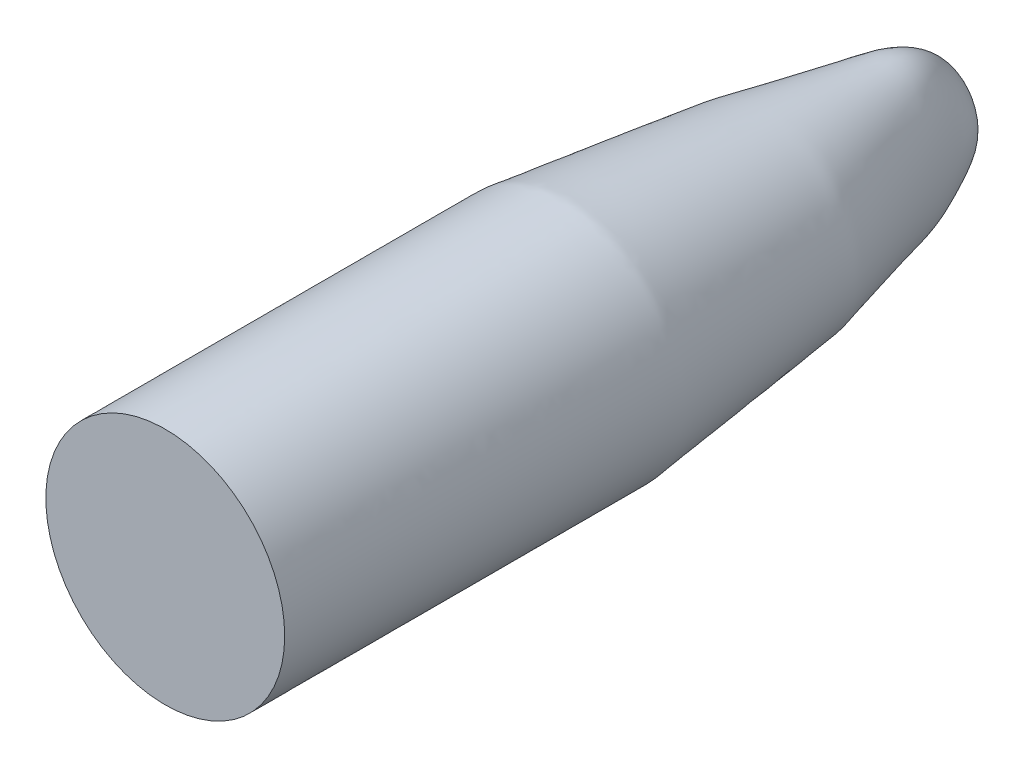
ISO-10303-21;
HEADER;
FILE_DESCRIPTION(('STEP AP214'),'2;1');
FILE_NAME('part.step','',(''),(''),'','','');
FILE_SCHEMA(('AUTOMOTIVE_DESIGN { 1 0 10303 214 1 1 1 1 }'));
ENDSEC;
DATA;
#1=APPLICATION_CONTEXT('core data for automotive mechanical design processes');
#2=APPLICATION_PROTOCOL_DEFINITION('international standard','automotive_design',2000,#1);
#3=PRODUCT_CONTEXT('',#1,'mechanical');
#4=PRODUCT('Part','Part','',(#3));
#5=PRODUCT_RELATED_PRODUCT_CATEGORY('part','',(#4));
#6=PRODUCT_DEFINITION_FORMATION('','',#4);
#7=PRODUCT_DEFINITION_CONTEXT('part definition',#1,'design');
#8=PRODUCT_DEFINITION('design','',#6,#7);
#9=PRODUCT_DEFINITION_SHAPE('','',#8);
#10=(LENGTH_UNIT() NAMED_UNIT(*) SI_UNIT(.MILLI.,.METRE.));
#11=(NAMED_UNIT(*) PLANE_ANGLE_UNIT() SI_UNIT($,.RADIAN.));
#12=(NAMED_UNIT(*) SI_UNIT($,.STERADIAN.) SOLID_ANGLE_UNIT());
#13=UNCERTAINTY_MEASURE_WITH_UNIT(LENGTH_MEASURE(1.E-05),#10,'distance_accuracy_value','');
#14=(GEOMETRIC_REPRESENTATION_CONTEXT(3) GLOBAL_UNCERTAINTY_ASSIGNED_CONTEXT((#13)) GLOBAL_UNIT_ASSIGNED_CONTEXT((#10,
#11,#12)) REPRESENTATION_CONTEXT('',''));
#15=CARTESIAN_POINT('',(0.,0.,0.));
#16=DIRECTION('',(0.,0.,1.));
#17=DIRECTION('',(1.,0.,0.));
#18=AXIS2_PLACEMENT_3D('',#15,#16,#17);
#19=CARTESIAN_POINT('',(0.,0.,0.));
#20=DIRECTION('',(0.,0.,1.));
#21=DIRECTION('',(1.,0.,0.));
#22=AXIS2_PLACEMENT_3D('',#19,#20,#21);
#23=PLANE('',#22);
#24=CARTESIAN_POINT('',(0.,0.,0.));
#25=DIRECTION('',(0.,0.,1.));
#26=DIRECTION('',(1.,0.,0.));
#27=AXIS2_PLACEMENT_3D('',#24,#25,#26);
#28=CIRCLE('',#27,6.);
#29=CARTESIAN_POINT('',(6.,0.,0.));
#30=VERTEX_POINT('',#29);
#31=EDGE_CURVE('E13',#30,#30,#28,.T.);
#32=ORIENTED_EDGE('',*,*,#31,.T.);
#33=EDGE_LOOP('',(#32));
#34=FACE_BOUND('',#33,.T.);
#35=ADVANCED_FACE('F114',(#34),#23,.T.);
#36=CARTESIAN_POINT('',(6.,0.,0.));
#37=CARTESIAN_POINT('',(6.,0.,-0.414814814814815));
#38=CARTESIAN_POINT('',(6.00001420185176,0.,-1.2444111321226));
#39=CARTESIAN_POINT('',(6.00006640985377,0.,-2.48872839842398));
#40=CARTESIAN_POINT('',(6.00014207351683,0.,-3.80705444331949));
#41=CARTESIAN_POINT('',(6.00023113572833,0.,-5.19940503915875));
#42=CARTESIAN_POINT('',(6.00032393865417,0.,-6.7991194723834));
#43=CARTESIAN_POINT('',(6.00038702697007,0.,-8.53218413886045));
#44=CARTESIAN_POINT('',(6.00037150531481,0.,-10.2653656136855));
#45=CARTESIAN_POINT('',(6.00026216831516,0.,-11.8653804066354));
#46=CARTESIAN_POINT('',(6.00004832753572,0.,-13.465572163283));
#47=CARTESIAN_POINT('',(5.9997591793125,0.,-14.7642307998094));
#48=CARTESIAN_POINT('',(5.9993841645168,0.,-16.0091900010634));
#49=CARTESIAN_POINT('',(5.99897862525038,0.,-17.1208865536565));
#50=CARTESIAN_POINT('',(5.99893365039298,0.,-18.2163341221828));
#51=CARTESIAN_POINT('',(5.99939548447932,0.,-19.0957523697179));
#52=CARTESIAN_POINT('',(5.99984997916987,0.,-19.5852399626314));
#53=CARTESIAN_POINT('',(6.00150472005289,0.,-19.9017644598478));
#54=CARTESIAN_POINT('',(5.996129891164,0.,-19.9998195550295));
#55=CARTESIAN_POINT('',(5.99558002790296,0.,-20.0098473567209));
#56=CARTESIAN_POINT('',(5.98837930322439,0.,-20.1278339676391));
#57=CARTESIAN_POINT('',(5.88039514830993,0.,-20.8860189548205));
#58=CARTESIAN_POINT('',(5.52781604612227,0.,-23.7834336674152));
#59=CARTESIAN_POINT('',(5.18454630374735,0.,-26.7923540244967));
#60=CARTESIAN_POINT('',(4.84472626496984,0.,-29.3603382285488));
#61=CARTESIAN_POINT('',(4.78835475473473,0.,-30.0087891881812));
#62=CARTESIAN_POINT('',(4.55861332183848,0.,-30.6179496993016));
#63=CARTESIAN_POINT('',(4.02767985190393,0.,-32.2609183020531));
#64=CARTESIAN_POINT('',(3.39584537371439,0.,-34.1005896008366));
#65=CARTESIAN_POINT('',(2.71494094961282,0.,-36.1506584456956));
#66=CARTESIAN_POINT('',(2.37587641694779,0.,-37.1767522556246));
#67=CARTESIAN_POINT('',(2.02074718443247,0.,-38.1942956962808));
#68=CARTESIAN_POINT('',(1.66976123000768,0.,-39.4784536691222));
#69=CARTESIAN_POINT('',(0.64788689143517,0.,-39.9952551232074));
#70=CARTESIAN_POINT('',(0.,0.,-40.));
#71=CARTESIAN_POINT('',(6.,-3.3114900595386,0.));
#72=CARTESIAN_POINT('',(6.,-3.31149005955954,-0.414814814814815));
#73=CARTESIAN_POINT('',(6.00001420185176,-3.31148939035369,-1.2444111321226));
#74=CARTESIAN_POINT('',(6.00006640985377,-3.31148814403347,-2.48872839842398));
#75=CARTESIAN_POINT('',(6.00014207351683,-3.31148843928255,-3.8070544433195));
#76=CARTESIAN_POINT('',(6.00023113572832,-3.31149275349493,-5.19940503915876));
#77=CARTESIAN_POINT('',(6.00032393865417,-3.31150587715141,-6.79911947238342));
#78=CARTESIAN_POINT('',(6.00038702697006,-3.31153385766345,-8.53218413886047));
#79=CARTESIAN_POINT('',(6.00037150531481,-3.31158344984076,-10.2653656136855));
#80=CARTESIAN_POINT('',(6.00026216831516,-3.31164961761649,-11.8653804066354));
#81=CARTESIAN_POINT('',(6.00004832753572,-3.31174402474773,-13.465572163283));
#82=CARTESIAN_POINT('',(5.9997591793125,-3.31182424333871,-14.7642307998094));
#83=CARTESIAN_POINT('',(5.9993841645168,-3.31196720643618,-16.0091900010634));
#84=CARTESIAN_POINT('',(5.99897862525038,-3.31209510552606,-17.1208865536565));
#85=CARTESIAN_POINT('',(5.99893365039298,-3.31179784557454,-18.2163341221828));
#86=CARTESIAN_POINT('',(5.99939548447932,-3.31166448406237,-19.0957523697179));
#87=CARTESIAN_POINT('',(5.99984997916987,-3.31137531185018,-19.5852399626314));
#88=CARTESIAN_POINT('',(6.00150472005288,-3.31229252496899,-19.9017644599462));
#89=CARTESIAN_POINT('',(5.996129891164,-3.30945188410683,-19.9998195551281));
#90=CARTESIAN_POINT('',(5.99558002790296,-3.30916127729427,-20.0098473568195));
#91=CARTESIAN_POINT('',(5.98837930322439,-3.30535399892508,-20.1278339677377));
#92=CARTESIAN_POINT('',(5.88039514830993,-3.24812721550649,-20.8860189548205));
#93=CARTESIAN_POINT('',(5.52781604612227,-3.05634053766797,-23.7834336674152));
#94=CARTESIAN_POINT('',(5.18454630374735,-2.83496105781337,-26.7923540244967));
#95=CARTESIAN_POINT('',(4.84472626496984,-2.63304322749711,-29.3603382285488));
#96=CARTESIAN_POINT('',(4.78835475473473,-2.58210775340949,-30.0087891881812));
#97=CARTESIAN_POINT('',(4.55861332183848,-2.53071900016035,-30.6179496993016));
#98=CARTESIAN_POINT('',(4.02767985190393,-2.39248087999065,-32.2609183020531));
#99=CARTESIAN_POINT('',(3.39584537371439,-2.22200582070854,-34.1005896008366));
#100=CARTESIAN_POINT('',(2.71494094961282,-2.06476502146873,-36.1506584456956));
#101=CARTESIAN_POINT('',(2.37587641694779,-1.80469204750867,-37.1767522556246));
#102=CARTESIAN_POINT('',(2.02074718443247,-1.44605040819742,-38.1942956962808));
#103=CARTESIAN_POINT('',(1.66976123000768,-0.90931683359303,-39.4784536691222));
#104=CARTESIAN_POINT('',(0.64788689143517,-0.351874709958155,-39.9952551232074));
#105=CARTESIAN_POINT('',(0.,0.,-40.));
#106=CARTESIAN_POINT('',(3.3114900595386,-6.,0.));
#107=CARTESIAN_POINT('',(3.31149005955954,-6.,-0.414814814814815));
#108=CARTESIAN_POINT('',(3.31149716052731,-5.99999866150452,-1.24446018585541));
#109=CARTESIAN_POINT('',(3.31152326421416,-5.9999961694924,-2.48898371187798));
#110=CARTESIAN_POINT('',(3.31156109731053,-5.99999675746087,-3.80765352644293));
#111=CARTESIAN_POINT('',(3.31160562285922,-6.00000539699976,-5.20049362952051));
#112=CARTESIAN_POINT('',(3.31165204767695,-6.00003159760308,-6.80090177175512));
#113=CARTESIAN_POINT('',(3.31168348123993,-6.00008777981707,-8.53484775067538));
#114=CARTESIAN_POINT('',(3.31167612118357,-6.00018616262915,-10.2690105218224));
#115=CARTESIAN_POINT('',(3.31162026224618,-6.00032087905574,-11.869976125182));
#116=CARTESIAN_POINT('',(3.31151792090965,-6.00050053521184,-13.4711324273602));
#117=CARTESIAN_POINT('',(3.31135704861968,-6.00069356875053,-14.7705625503233));
#118=CARTESIAN_POINT('',(3.31120091006548,-6.00091675725817,-16.0162322314936));
#119=CARTESIAN_POINT('',(3.31101277144021,-6.00114329342206,-17.1285388583828));
#120=CARTESIAN_POINT('',(3.31083001540695,-6.00086931072813,-18.2202411443905));
#121=CARTESIAN_POINT('',(3.31135278504585,-6.00001888251238,-19.0913884068492));
#122=CARTESIAN_POINT('',(3.31165094721729,-5.99929870843567,-19.5742242475512));
#123=CARTESIAN_POINT('',(3.3123191672435,-6.00145151872967,-19.8984340130037));
#124=CARTESIAN_POINT('',(3.30955464670183,-5.99592349965363,-19.9997368270245));
#125=CARTESIAN_POINT('',(3.30927182957811,-5.99535795987539,-20.0100967922604));
#126=CARTESIAN_POINT('',(3.30557523745254,-5.98793460008023,-20.1321001309065));
#127=CARTESIAN_POINT('',(3.25071075597417,-5.8752280673746,-20.9240890143224));
#128=CARTESIAN_POINT('',(3.06501406420192,-5.51046899305436,-23.9380019555751));
#129=CARTESIAN_POINT('',(2.8623273157736,-5.12981378782688,-27.0659257187691));
#130=CARTESIAN_POINT('',(2.65550427794138,-4.79980416408129,-29.7490723390655));
#131=CARTESIAN_POINT('',(2.61764561969104,-4.71727902217164,-30.4199255808124));
#132=CARTESIAN_POINT('',(2.49268075414198,-4.63468981387522,-31.0907970774884));
#133=CARTESIAN_POINT('',(2.19923537246729,-4.41417086695065,-32.8797075304516));
#134=CARTESIAN_POINT('',(1.84791052679074,-4.14403596155001,-34.8805677248959));
#135=CARTESIAN_POINT('',(1.46499618914435,-3.91447861426158,-37.1425611850284));
#136=CARTESIAN_POINT('',(1.27360879191309,-3.43804292813896,-38.120165916581));
#137=CARTESIAN_POINT('',(1.0738380064499,-2.7651719879275,-38.9426415814166));
#138=CARTESIAN_POINT('',(0.871346587884098,-1.74570172142554,-39.7180719590067));
#139=CARTESIAN_POINT('',(0.337618185547682,-0.676399940256116,-40.));
#140=CARTESIAN_POINT('',(0.,0.,-40.));
#141=CARTESIAN_POINT('',(0.,-6.,0.));
#142=CARTESIAN_POINT('',(0.,-6.,-0.414814814814815));
#143=CARTESIAN_POINT('',(0.,-5.99999866150452,-1.24446018585541));
#144=CARTESIAN_POINT('',(0.,-5.99999616949239,-2.48898371187798));
#145=CARTESIAN_POINT('',(0.,-5.99999675746087,-3.80765352644293));
#146=CARTESIAN_POINT('',(0.,-6.00000539699975,-5.20049362952051));
#147=CARTESIAN_POINT('',(0.,-6.00003159760308,-6.80090177175513));
#148=CARTESIAN_POINT('',(0.,-6.00008777981707,-8.53484775067539));
#149=CARTESIAN_POINT('',(0.,-6.00018616262915,-10.2690105218224));
#150=CARTESIAN_POINT('',(0.,-6.00032087905574,-11.869976125182));
#151=CARTESIAN_POINT('',(0.,-6.00050053521184,-13.4711324273602));
#152=CARTESIAN_POINT('',(0.,-6.00069356875053,-14.7705625503233));
#153=CARTESIAN_POINT('',(0.,-6.00091675725817,-16.0162322314936));
#154=CARTESIAN_POINT('',(0.,-6.00114329342206,-17.1285388583828));
#155=CARTESIAN_POINT('',(0.,-6.00086931072813,-18.2202411443905));
#156=CARTESIAN_POINT('',(0.,-6.00001888251237,-19.0913884068492));
#157=CARTESIAN_POINT('',(0.,-5.99929870843567,-19.5742242475513));
#158=CARTESIAN_POINT('',(0.,-6.00145151872967,-19.8984419727365));
#159=CARTESIAN_POINT('',(0.,-5.99592349965363,-19.9997447264258));
#160=CARTESIAN_POINT('',(0.,-5.99535795987539,-20.0101046854903));
#161=CARTESIAN_POINT('',(0.,-5.98793460008023,-20.1321079457852));
#162=CARTESIAN_POINT('',(0.,-5.8752280673746,-20.9240890143224));
#163=CARTESIAN_POINT('',(0.,-5.51046899305436,-23.9380019555751));
#164=CARTESIAN_POINT('',(0.,-5.12981378782688,-27.0659257187691));
#165=CARTESIAN_POINT('',(0.,-4.79980416408129,-29.7490723390655));
#166=CARTESIAN_POINT('',(0.,-4.71727902217164,-30.4199255808124));
#167=CARTESIAN_POINT('',(0.,-4.63468981387522,-31.0907970774884));
#168=CARTESIAN_POINT('',(0.,-4.41417086695065,-32.8797075304517));
#169=CARTESIAN_POINT('',(0.,-4.14403596155001,-34.8805677248959));
#170=CARTESIAN_POINT('',(0.,-3.91447861426158,-37.1425611850284));
#171=CARTESIAN_POINT('',(0.,-3.43804292813896,-38.120165916581));
#172=CARTESIAN_POINT('',(0.,-2.7651719879275,-38.9426415814166));
#173=CARTESIAN_POINT('',(0.,-1.74570172142554,-39.7180719590067));
#174=CARTESIAN_POINT('',(0.,-0.676399940256116,-40.));
#175=CARTESIAN_POINT('',(0.,0.,-40.));
#176=CARTESIAN_POINT('',(-3.3114900595386,-6.,0.));
#177=CARTESIAN_POINT('',(-3.31149005955954,-6.,-0.414814814814815));
#178=CARTESIAN_POINT('',(-3.31149716052731,-5.99999866150451,-1.24446018585541));
#179=CARTESIAN_POINT('',(-3.31152326421416,-5.9999961694924,-2.48898371187798));
#180=CARTESIAN_POINT('',(-3.31156109731054,-5.99999675746087,-3.80765352644293));
#181=CARTESIAN_POINT('',(-3.31160562285922,-6.00000539699975,-5.20049362952052));
#182=CARTESIAN_POINT('',(-3.31165204767695,-6.00003159760308,-6.80090177175513));
#183=CARTESIAN_POINT('',(-3.31168348123993,-6.00008777981707,-8.53484775067539));
#184=CARTESIAN_POINT('',(-3.31167612118358,-6.00018616262915,-10.2690105218224));
#185=CARTESIAN_POINT('',(-3.31162026224618,-6.00032087905574,-11.869976125182));
#186=CARTESIAN_POINT('',(-3.31151792090965,-6.00050053521184,-13.4711324273602));
#187=CARTESIAN_POINT('',(-3.31135704861968,-6.00069356875053,-14.7705625503234));
#188=CARTESIAN_POINT('',(-3.31120091006548,-6.00091675725817,-16.0162322314936));
#189=CARTESIAN_POINT('',(-3.31101277144021,-6.00114329342206,-17.1285388583828));
#190=CARTESIAN_POINT('',(-3.31083001540695,-6.00086931072813,-18.2202411443905));
#191=CARTESIAN_POINT('',(-3.31135278504585,-6.00001888251237,-19.0913884068492));
#192=CARTESIAN_POINT('',(-3.31165094721729,-5.99929870843567,-19.5742242475514));
#193=CARTESIAN_POINT('',(-3.3123191672435,-6.00145151872966,-19.8984499324693));
#194=CARTESIAN_POINT('',(-3.30955464670183,-5.99592349965363,-19.9997526258271));
#195=CARTESIAN_POINT('',(-3.30927182957812,-5.99535795987539,-20.0101125787202));
#196=CARTESIAN_POINT('',(-3.30557523745254,-5.98793460008023,-20.132115760664));
#197=CARTESIAN_POINT('',(-3.25071075597417,-5.8752280673746,-20.9240890143224));
#198=CARTESIAN_POINT('',(-3.06501406420192,-5.51046899305436,-23.9380019555751));
#199=CARTESIAN_POINT('',(-2.8623273157736,-5.12981378782688,-27.0659257187691));
#200=CARTESIAN_POINT('',(-2.65550427794138,-4.79980416408129,-29.7490723390654));
#201=CARTESIAN_POINT('',(-2.61764561969104,-4.71727902217164,-30.4199255808124));
#202=CARTESIAN_POINT('',(-2.49268075414198,-4.63468981387522,-31.0907970774884));
#203=CARTESIAN_POINT('',(-2.19923537246729,-4.41417086695065,-32.8797075304518));
#204=CARTESIAN_POINT('',(-1.84791052679074,-4.14403596155001,-34.8805677248958));
#205=CARTESIAN_POINT('',(-1.46499618914435,-3.91447861426158,-37.1425611850284));
#206=CARTESIAN_POINT('',(-1.27360879191309,-3.43804292813896,-38.120165916581));
#207=CARTESIAN_POINT('',(-1.0738380064499,-2.7651719879275,-38.9426415814166));
#208=CARTESIAN_POINT('',(-0.871346587884098,-1.74570172142554,-39.7180719590066));
#209=CARTESIAN_POINT('',(-0.337618185547682,-0.676399940256116,-40.));
#210=CARTESIAN_POINT('',(0.,0.,-40.));
#211=CARTESIAN_POINT('',(-6.,-3.3114900595386,0.));
#212=CARTESIAN_POINT('',(-6.,-3.31149005955954,-0.414814814814815));
#213=CARTESIAN_POINT('',(-6.00001420185176,-3.31148939035369,-1.2444111321226));
#214=CARTESIAN_POINT('',(-6.00006640985377,-3.31148814403347,-2.48872839842398));
#215=CARTESIAN_POINT('',(-6.00014207351682,-3.31148843928255,-3.8070544433195));
#216=CARTESIAN_POINT('',(-6.00023113572829,-3.31149275349493,-5.19940503915877));
#217=CARTESIAN_POINT('',(-6.00032393865412,-3.31150587715141,-6.79911947238342));
#218=CARTESIAN_POINT('',(-6.00038702697,-3.31153385766345,-8.53218413886048));
#219=CARTESIAN_POINT('',(-6.00037150531473,-3.31158344984076,-10.2653656136855));
#220=CARTESIAN_POINT('',(-6.00026216831507,-3.31164961761649,-11.8653804066355));
#221=CARTESIAN_POINT('',(-6.00004832753564,-3.31174402474772,-13.4655721632831));
#222=CARTESIAN_POINT('',(-5.99975917931243,-3.31182424333871,-14.7642307998095));
#223=CARTESIAN_POINT('',(-5.99938416451675,-3.31196720643618,-16.0091900010634));
#224=CARTESIAN_POINT('',(-5.99897862525035,-3.31209510552606,-17.1208865536565));
#225=CARTESIAN_POINT('',(-5.99893365039296,-3.31179784557454,-18.2163341221828));
#226=CARTESIAN_POINT('',(-5.99939548447932,-3.31166448406237,-19.0957523697179));
#227=CARTESIAN_POINT('',(-5.99984997916987,-3.31137531185018,-19.5852399626318));
#228=CARTESIAN_POINT('',(-6.00150488650187,-3.31229252496899,-19.9017962988774));
#229=CARTESIAN_POINT('',(-5.99612815854475,-3.30945188410683,-19.9998511527333));
#230=CARTESIAN_POINT('',(-5.99557810100718,-3.30916127729427,-20.0098789297392));
#231=CARTESIAN_POINT('',(-5.98837485110206,-3.30535399892508,-20.1278652272527));
#232=CARTESIAN_POINT('',(-5.88039514830992,-3.24812721550649,-20.8860189548205));
#233=CARTESIAN_POINT('',(-5.52781604612222,-3.05634053766797,-23.7834336674152));
#234=CARTESIAN_POINT('',(-5.18454630374733,-2.83496105781337,-26.7923540244969));
#235=CARTESIAN_POINT('',(-4.84472626496984,-2.63304322749711,-29.3603382285488));
#236=CARTESIAN_POINT('',(-4.78835475473474,-2.58210775340949,-30.0087891881813));
#237=CARTESIAN_POINT('',(-4.55861332183848,-2.53071900016035,-30.6179496993015));
#238=CARTESIAN_POINT('',(-4.02767985190393,-2.39248087999065,-32.2609183020534));
#239=CARTESIAN_POINT('',(-3.39584537371439,-2.22200582070854,-34.1005896008365));
#240=CARTESIAN_POINT('',(-2.71494094961282,-2.06476502146873,-36.1506584456957));
#241=CARTESIAN_POINT('',(-2.3758764169478,-1.80469204750867,-37.1767522556246));
#242=CARTESIAN_POINT('',(-2.02074718443246,-1.44605040819742,-38.1942956962807));
#243=CARTESIAN_POINT('',(-1.66976123000768,-0.90931683359303,-39.4784536691221));
#244=CARTESIAN_POINT('',(-0.64788689143517,-0.351874709958155,-39.9952551232074));
#245=CARTESIAN_POINT('',(0.,0.,-40.));
#246=CARTESIAN_POINT('',(-6.,0.,0.));
#247=CARTESIAN_POINT('',(-6.,0.,-0.414814814814815));
#248=CARTESIAN_POINT('',(-6.00001420185176,0.,-1.2444111321226));
#249=CARTESIAN_POINT('',(-6.00006640985377,0.,-2.48872839842398));
#250=CARTESIAN_POINT('',(-6.00014207351682,0.,-3.8070544433195));
#251=CARTESIAN_POINT('',(-6.00023113572829,0.,-5.19940503915876));
#252=CARTESIAN_POINT('',(-6.00032393865412,0.,-6.79911947238341));
#253=CARTESIAN_POINT('',(-6.00038702697,0.,-8.53218413886047));
#254=CARTESIAN_POINT('',(-6.00037150531473,0.,-10.2653656136855));
#255=CARTESIAN_POINT('',(-6.00026216831507,0.,-11.8653804066354));
#256=CARTESIAN_POINT('',(-6.00004832753564,0.,-13.465572163283));
#257=CARTESIAN_POINT('',(-5.99975917931243,0.,-14.7642307998094));
#258=CARTESIAN_POINT('',(-5.99938416451675,0.,-16.0091900010634));
#259=CARTESIAN_POINT('',(-5.99897862525035,0.,-17.1208865536565));
#260=CARTESIAN_POINT('',(-5.99893365039297,0.,-18.2163341221828));
#261=CARTESIAN_POINT('',(-5.99939548447932,0.,-19.0957523697179));
#262=CARTESIAN_POINT('',(-5.99984997916987,0.,-19.5852399626318));
#263=CARTESIAN_POINT('',(-6.00150488650188,0.,-19.901796298779));
#264=CARTESIAN_POINT('',(-5.99612815854475,0.,-19.9998511526348));
#265=CARTESIAN_POINT('',(-5.99557810100719,0.,-20.0098789296406));
#266=CARTESIAN_POINT('',(-5.98837485110206,0.,-20.1278652271541));
#267=CARTESIAN_POINT('',(-5.88039514830992,0.,-20.8860189548205));
#268=CARTESIAN_POINT('',(-5.52781604612222,0.,-23.7834336674152));
#269=CARTESIAN_POINT('',(-5.18454630374733,0.,-26.7923540244969));
#270=CARTESIAN_POINT('',(-4.84472626496984,0.,-29.3603382285488));
#271=CARTESIAN_POINT('',(-4.78835475473474,0.,-30.0087891881813));
#272=CARTESIAN_POINT('',(-4.55861332183848,0.,-30.6179496993015));
#273=CARTESIAN_POINT('',(-4.02767985190393,0.,-32.2609183020534));
#274=CARTESIAN_POINT('',(-3.39584537371439,0.,-34.1005896008365));
#275=CARTESIAN_POINT('',(-2.71494094961282,0.,-36.1506584456957));
#276=CARTESIAN_POINT('',(-2.3758764169478,0.,-37.1767522556246));
#277=CARTESIAN_POINT('',(-2.02074718443246,0.,-38.1942956962807));
#278=CARTESIAN_POINT('',(-1.66976123000768,0.,-39.4784536691221));
#279=CARTESIAN_POINT('',(-0.64788689143517,0.,-39.9952551232074));
#280=CARTESIAN_POINT('',(0.,0.,-40.));
#281=CARTESIAN_POINT('',(-6.,3.3114900595386,0.));
#282=CARTESIAN_POINT('',(-6.,3.31149005955954,-0.414814814814815));
#283=CARTESIAN_POINT('',(-6.00001420185176,3.31148939035369,-1.2444111321226));
#284=CARTESIAN_POINT('',(-6.00006640985377,3.31148814403347,-2.48872839842398));
#285=CARTESIAN_POINT('',(-6.00014207351682,3.31148843928255,-3.80705444331949));
#286=CARTESIAN_POINT('',(-6.00023113572829,3.31149275349494,-5.19940503915875));
#287=CARTESIAN_POINT('',(-6.00032393865412,3.31150587715141,-6.79911947238339));
#288=CARTESIAN_POINT('',(-6.00038702697,3.31153385766345,-8.53218413886045));
#289=CARTESIAN_POINT('',(-6.00037150531473,3.31158344984076,-10.2653656136855));
#290=CARTESIAN_POINT('',(-6.00026216831507,3.31164961761649,-11.8653804066354));
#291=CARTESIAN_POINT('',(-6.00004832753564,3.31174402474773,-13.465572163283));
#292=CARTESIAN_POINT('',(-5.99975917931243,3.31182424333871,-14.7642307998094));
#293=CARTESIAN_POINT('',(-5.99938416451675,3.31196720643618,-16.0091900010634));
#294=CARTESIAN_POINT('',(-5.99897862525035,3.31209510552606,-17.1208865536565));
#295=CARTESIAN_POINT('',(-5.99893365039297,3.31179784557454,-18.2163341221828));
#296=CARTESIAN_POINT('',(-5.99939548447932,3.31166448406237,-19.095752369718));
#297=CARTESIAN_POINT('',(-5.99984997916987,3.31137531185018,-19.5852399626318));
#298=CARTESIAN_POINT('',(-6.00150488650188,3.31229252496899,-19.9017962986805));
#299=CARTESIAN_POINT('',(-5.99612815854475,3.30945188410683,-19.9998511525362));
#300=CARTESIAN_POINT('',(-5.99557810100719,3.30916127729427,-20.009878929542));
#301=CARTESIAN_POINT('',(-5.98837485110206,3.30535399892508,-20.1278652270555));
#302=CARTESIAN_POINT('',(-5.88039514830992,3.2481272155065,-20.8860189548205));
#303=CARTESIAN_POINT('',(-5.52781604612222,3.05634053766797,-23.7834336674152));
#304=CARTESIAN_POINT('',(-5.18454630374733,2.83496105781337,-26.7923540244969));
#305=CARTESIAN_POINT('',(-4.84472626496984,2.63304322749711,-29.3603382285488));
#306=CARTESIAN_POINT('',(-4.78835475473474,2.58210775340949,-30.0087891881813));
#307=CARTESIAN_POINT('',(-4.55861332183848,2.53071900016035,-30.6179496993015));
#308=CARTESIAN_POINT('',(-4.02767985190393,2.39248087999065,-32.2609183020534));
#309=CARTESIAN_POINT('',(-3.39584537371439,2.22200582070854,-34.1005896008365));
#310=CARTESIAN_POINT('',(-2.71494094961282,2.06476502146873,-36.1506584456957));
#311=CARTESIAN_POINT('',(-2.3758764169478,1.80469204750867,-37.1767522556246));
#312=CARTESIAN_POINT('',(-2.02074718443246,1.44605040819742,-38.1942956962807));
#313=CARTESIAN_POINT('',(-1.66976123000768,0.90931683359303,-39.4784536691221));
#314=CARTESIAN_POINT('',(-0.64788689143517,0.351874709958155,-39.9952551232074));
#315=CARTESIAN_POINT('',(0.,0.,-40.));
#316=CARTESIAN_POINT('',(-3.3114900595386,6.,0.));
#317=CARTESIAN_POINT('',(-3.31149005955954,6.,-0.414814814814815));
#318=CARTESIAN_POINT('',(-3.31149716052731,5.99999866150452,-1.24446018585541));
#319=CARTESIAN_POINT('',(-3.31152326421416,5.99999616949239,-2.48898371187797));
#320=CARTESIAN_POINT('',(-3.31156109731054,5.99999675746086,-3.80765352644291));
#321=CARTESIAN_POINT('',(-3.31160562285922,6.00000539699974,-5.20049362952047));
#322=CARTESIAN_POINT('',(-3.31165204767695,6.00003159760306,-6.80090177175507));
#323=CARTESIAN_POINT('',(-3.31168348123993,6.00008777981705,-8.53484775067531));
#324=CARTESIAN_POINT('',(-3.31167612118358,6.00018616262912,-10.2690105218223));
#325=CARTESIAN_POINT('',(-3.31162026224618,6.00032087905571,-11.8699761251819));
#326=CARTESIAN_POINT('',(-3.31151792090965,6.00050053521182,-13.4711324273602));
#327=CARTESIAN_POINT('',(-3.31135704861968,6.00069356875052,-14.7705625503233));
#328=CARTESIAN_POINT('',(-3.31120091006548,6.00091675725818,-16.0162322314935));
#329=CARTESIAN_POINT('',(-3.31101277144021,6.00114329342208,-17.1285388583828));
#330=CARTESIAN_POINT('',(-3.31083001540695,6.00086931072815,-18.2202411443906));
#331=CARTESIAN_POINT('',(-3.31135278504585,6.00001888251237,-19.0913884068492));
#332=CARTESIAN_POINT('',(-3.31165094721729,5.99929870843564,-19.5742242475515));
#333=CARTESIAN_POINT('',(-3.3123191672435,6.00145151872706,-19.8984499320755));
#334=CARTESIAN_POINT('',(-3.30955464670183,5.99592349967515,-19.9997526254329));
#335=CARTESIAN_POINT('',(-3.30927182957811,5.99535795989938,-20.0101125783259));
#336=CARTESIAN_POINT('',(-3.30557523745254,5.98793460013636,-20.1321157602697));
#337=CARTESIAN_POINT('',(-3.25071075597417,5.87522806737453,-20.9240890143224));
#338=CARTESIAN_POINT('',(-3.06501406420192,5.51046899305433,-23.9380019555751));
#339=CARTESIAN_POINT('',(-2.8623273157736,5.12981378782689,-27.0659257187692));
#340=CARTESIAN_POINT('',(-2.65550427794138,4.79980416408129,-29.7490723390655));
#341=CARTESIAN_POINT('',(-2.61764561969104,4.71727902217164,-30.4199255808124));
#342=CARTESIAN_POINT('',(-2.49268075414198,4.63468981387522,-31.0907970774884));
#343=CARTESIAN_POINT('',(-2.19923537246729,4.41417086695064,-32.8797075304518));
#344=CARTESIAN_POINT('',(-1.84791052679074,4.14403596155,-34.8805677248958));
#345=CARTESIAN_POINT('',(-1.46499618914435,3.91447861426159,-37.1425611850284));
#346=CARTESIAN_POINT('',(-1.27360879191309,3.43804292813896,-38.120165916581));
#347=CARTESIAN_POINT('',(-1.0738380064499,2.7651719879275,-38.9426415814166));
#348=CARTESIAN_POINT('',(-0.871346587884098,1.74570172142555,-39.7180719590066));
#349=CARTESIAN_POINT('',(-0.337618185547682,0.676399940256117,-40.));
#350=CARTESIAN_POINT('',(0.,0.,-40.));
#351=CARTESIAN_POINT('',(0.,6.,0.));
#352=CARTESIAN_POINT('',(0.,6.,-0.414814814814815));
#353=CARTESIAN_POINT('',(0.,5.99999866150452,-1.24446018585541));
#354=CARTESIAN_POINT('',(0.,5.99999616949239,-2.48898371187797));
#355=CARTESIAN_POINT('',(0.,5.99999675746086,-3.80765352644291));
#356=CARTESIAN_POINT('',(0.,6.00000539699974,-5.20049362952047));
#357=CARTESIAN_POINT('',(0.,6.00003159760306,-6.80090177175506));
#358=CARTESIAN_POINT('',(0.,6.00008777981705,-8.5348477506753));
#359=CARTESIAN_POINT('',(0.,6.00018616262912,-10.2690105218223));
#360=CARTESIAN_POINT('',(0.,6.00032087905571,-11.8699761251819));
#361=CARTESIAN_POINT('',(0.,6.00050053521182,-13.4711324273602));
#362=CARTESIAN_POINT('',(0.,6.00069356875052,-14.7705625503233));
#363=CARTESIAN_POINT('',(0.,6.00091675725818,-16.0162322314935));
#364=CARTESIAN_POINT('',(0.,6.00114329342208,-17.1285388583828));
#365=CARTESIAN_POINT('',(0.,6.00086931072816,-18.2202411443906));
#366=CARTESIAN_POINT('',(0.,6.00001888251237,-19.0913884068492));
#367=CARTESIAN_POINT('',(0.,5.99929870843564,-19.5742242475513));
#368=CARTESIAN_POINT('',(0.,6.00145151872706,-19.8984419723427));
#369=CARTESIAN_POINT('',(0.,5.99592349967515,-19.9997447260316));
#370=CARTESIAN_POINT('',(0.,5.99535795989938,-20.010104685096));
#371=CARTESIAN_POINT('',(0.,5.98793460013636,-20.1321079453909));
#372=CARTESIAN_POINT('',(0.,5.87522806737453,-20.9240890143224));
#373=CARTESIAN_POINT('',(0.,5.51046899305434,-23.9380019555751));
#374=CARTESIAN_POINT('',(0.,5.12981378782689,-27.0659257187691));
#375=CARTESIAN_POINT('',(0.,4.79980416408129,-29.7490723390655));
#376=CARTESIAN_POINT('',(0.,4.71727902217164,-30.4199255808124));
#377=CARTESIAN_POINT('',(0.,4.63468981387522,-31.0907970774884));
#378=CARTESIAN_POINT('',(0.,4.41417086695064,-32.8797075304517));
#379=CARTESIAN_POINT('',(0.,4.14403596155,-34.8805677248959));
#380=CARTESIAN_POINT('',(0.,3.91447861426159,-37.1425611850284));
#381=CARTESIAN_POINT('',(0.,3.43804292813896,-38.120165916581));
#382=CARTESIAN_POINT('',(0.,2.7651719879275,-38.9426415814166));
#383=CARTESIAN_POINT('',(0.,1.74570172142555,-39.7180719590066));
#384=CARTESIAN_POINT('',(0.,0.676399940256117,-40.));
#385=CARTESIAN_POINT('',(0.,0.,-40.));
#386=CARTESIAN_POINT('',(3.3114900595386,6.,0.));
#387=CARTESIAN_POINT('',(3.31149005955954,6.,-0.414814814814815));
#388=CARTESIAN_POINT('',(3.31149716052731,5.99999866150452,-1.24446018585541));
#389=CARTESIAN_POINT('',(3.31152326421416,5.99999616949239,-2.48898371187797));
#390=CARTESIAN_POINT('',(3.31156109731053,5.99999675746086,-3.80765352644291));
#391=CARTESIAN_POINT('',(3.31160562285922,6.00000539699974,-5.20049362952047));
#392=CARTESIAN_POINT('',(3.31165204767695,6.00003159760306,-6.80090177175506));
#393=CARTESIAN_POINT('',(3.31168348123993,6.00008777981705,-8.5348477506753));
#394=CARTESIAN_POINT('',(3.31167612118358,6.00018616262912,-10.2690105218223));
#395=CARTESIAN_POINT('',(3.31162026224618,6.00032087905571,-11.8699761251819));
#396=CARTESIAN_POINT('',(3.31151792090965,6.00050053521182,-13.4711324273602));
#397=CARTESIAN_POINT('',(3.31135704861968,6.00069356875052,-14.7705625503233));
#398=CARTESIAN_POINT('',(3.31120091006548,6.00091675725819,-16.0162322314935));
#399=CARTESIAN_POINT('',(3.31101277144021,6.00114329342208,-17.1285388583828));
#400=CARTESIAN_POINT('',(3.31083001540695,6.00086931072816,-18.2202411443906));
#401=CARTESIAN_POINT('',(3.31135278504585,6.00001888251237,-19.0913884068492));
#402=CARTESIAN_POINT('',(3.31165094721729,5.99929870843564,-19.5742242475512));
#403=CARTESIAN_POINT('',(3.3123191672435,6.00145151872706,-19.8984340126099));
#404=CARTESIAN_POINT('',(3.30955464670183,5.99592349967515,-19.9997368266303));
#405=CARTESIAN_POINT('',(3.30927182957811,5.99535795989938,-20.0100967918661));
#406=CARTESIAN_POINT('',(3.30557523745254,5.98793460013636,-20.1321001305121));
#407=CARTESIAN_POINT('',(3.25071075597417,5.87522806737453,-20.9240890143224));
#408=CARTESIAN_POINT('',(3.06501406420192,5.51046899305434,-23.9380019555751));
#409=CARTESIAN_POINT('',(2.8623273157736,5.12981378782689,-27.0659257187691));
#410=CARTESIAN_POINT('',(2.65550427794138,4.79980416408129,-29.7490723390655));
#411=CARTESIAN_POINT('',(2.61764561969104,4.71727902217164,-30.4199255808124));
#412=CARTESIAN_POINT('',(2.49268075414198,4.63468981387522,-31.0907970774884));
#413=CARTESIAN_POINT('',(2.19923537246729,4.41417086695064,-32.8797075304516));
#414=CARTESIAN_POINT('',(1.84791052679073,4.14403596155,-34.8805677248959));
#415=CARTESIAN_POINT('',(1.46499618914435,3.91447861426159,-37.1425611850283));
#416=CARTESIAN_POINT('',(1.27360879191309,3.43804292813896,-38.120165916581));
#417=CARTESIAN_POINT('',(1.0738380064499,2.7651719879275,-38.9426415814166));
#418=CARTESIAN_POINT('',(0.871346587884098,1.74570172142555,-39.7180719590067));
#419=CARTESIAN_POINT('',(0.337618185547682,0.676399940256117,-40.));
#420=CARTESIAN_POINT('',(0.,0.,-40.));
#421=CARTESIAN_POINT('',(6.,3.3114900595386,0.));
#422=CARTESIAN_POINT('',(6.,3.31149005955955,-0.414814814814815));
#423=CARTESIAN_POINT('',(6.00001420185176,3.31148939035369,-1.2444111321226));
#424=CARTESIAN_POINT('',(6.00006640985377,3.31148814403347,-2.48872839842398));
#425=CARTESIAN_POINT('',(6.00014207351683,3.31148843928255,-3.80705444331949));
#426=CARTESIAN_POINT('',(6.00023113572833,3.31149275349494,-5.19940503915874));
#427=CARTESIAN_POINT('',(6.00032393865417,3.31150587715142,-6.79911947238338));
#428=CARTESIAN_POINT('',(6.00038702697007,3.31153385766345,-8.53218413886043));
#429=CARTESIAN_POINT('',(6.00037150531481,3.31158344984076,-10.2653656136855));
#430=CARTESIAN_POINT('',(6.00026216831516,3.31164961761649,-11.8653804066354));
#431=CARTESIAN_POINT('',(6.00004832753572,3.31174402474773,-13.465572163283));
#432=CARTESIAN_POINT('',(5.9997591793125,3.31182424333872,-14.7642307998094));
#433=CARTESIAN_POINT('',(5.9993841645168,3.31196720643618,-16.0091900010634));
#434=CARTESIAN_POINT('',(5.99897862525038,3.31209510552607,-17.1208865536565));
#435=CARTESIAN_POINT('',(5.99893365039298,3.31179784557454,-18.2163341221828));
#436=CARTESIAN_POINT('',(5.99939548447932,3.31166448406238,-19.0957523697179));
#437=CARTESIAN_POINT('',(5.99984997916987,3.31137531185018,-19.5852399626314));
#438=CARTESIAN_POINT('',(6.00150472005289,3.312292524969,-19.9017644597493));
#439=CARTESIAN_POINT('',(5.996129891164,3.30945188410683,-19.999819554931));
#440=CARTESIAN_POINT('',(5.99558002790296,3.30916127729427,-20.0098473566223));
#441=CARTESIAN_POINT('',(5.98837930322439,3.30535399892508,-20.1278339675405));
#442=CARTESIAN_POINT('',(5.88039514830993,3.2481272155065,-20.8860189548205));
#443=CARTESIAN_POINT('',(5.52781604612227,3.05634053766797,-23.7834336674152));
#444=CARTESIAN_POINT('',(5.18454630374735,2.83496105781337,-26.7923540244967));
#445=CARTESIAN_POINT('',(4.84472626496984,2.63304322749711,-29.3603382285488));
#446=CARTESIAN_POINT('',(4.78835475473473,2.58210775340949,-30.0087891881812));
#447=CARTESIAN_POINT('',(4.55861332183848,2.53071900016035,-30.6179496993016));
#448=CARTESIAN_POINT('',(4.02767985190393,2.39248087999065,-32.2609183020531));
#449=CARTESIAN_POINT('',(3.39584537371439,2.22200582070854,-34.1005896008366));
#450=CARTESIAN_POINT('',(2.71494094961282,2.06476502146873,-36.1506584456956));
#451=CARTESIAN_POINT('',(2.37587641694779,1.80469204750867,-37.1767522556246));
#452=CARTESIAN_POINT('',(2.02074718443247,1.44605040819742,-38.1942956962808));
#453=CARTESIAN_POINT('',(1.66976123000768,0.90931683359303,-39.4784536691222));
#454=CARTESIAN_POINT('',(0.64788689143517,0.351874709958155,-39.9952551232074));
#455=CARTESIAN_POINT('',(0.,0.,-40.));
#456=CARTESIAN_POINT('',(6.,0.,0.));
#457=CARTESIAN_POINT('',(6.,0.,-0.414814814814815));
#458=CARTESIAN_POINT('',(6.00001420185176,0.,-1.2444111321226));
#459=CARTESIAN_POINT('',(6.00006640985377,0.,-2.48872839842398));
#460=CARTESIAN_POINT('',(6.00014207351683,0.,-3.80705444331949));
#461=CARTESIAN_POINT('',(6.00023113572833,0.,-5.19940503915875));
#462=CARTESIAN_POINT('',(6.00032393865417,0.,-6.7991194723834));
#463=CARTESIAN_POINT('',(6.00038702697007,0.,-8.53218413886045));
#464=CARTESIAN_POINT('',(6.00037150531481,0.,-10.2653656136855));
#465=CARTESIAN_POINT('',(6.00026216831516,0.,-11.8653804066354));
#466=CARTESIAN_POINT('',(6.00004832753572,0.,-13.465572163283));
#467=CARTESIAN_POINT('',(5.9997591793125,0.,-14.7642307998094));
#468=CARTESIAN_POINT('',(5.9993841645168,0.,-16.0091900010634));
#469=CARTESIAN_POINT('',(5.99897862525038,0.,-17.1208865536565));
#470=CARTESIAN_POINT('',(5.99893365039298,0.,-18.2163341221828));
#471=CARTESIAN_POINT('',(5.99939548447932,0.,-19.0957523697179));
#472=CARTESIAN_POINT('',(5.99984997916987,0.,-19.5852399626314));
#473=CARTESIAN_POINT('',(6.00150472005289,0.,-19.9017644598478));
#474=CARTESIAN_POINT('',(5.996129891164,0.,-19.9998195550295));
#475=CARTESIAN_POINT('',(5.99558002790296,0.,-20.0098473567209));
#476=CARTESIAN_POINT('',(5.98837930322439,0.,-20.1278339676391));
#477=CARTESIAN_POINT('',(5.88039514830993,0.,-20.8860189548205));
#478=CARTESIAN_POINT('',(5.52781604612227,0.,-23.7834336674152));
#479=CARTESIAN_POINT('',(5.18454630374735,0.,-26.7923540244967));
#480=CARTESIAN_POINT('',(4.84472626496984,0.,-29.3603382285488));
#481=CARTESIAN_POINT('',(4.78835475473473,0.,-30.0087891881812));
#482=CARTESIAN_POINT('',(4.55861332183848,0.,-30.6179496993016));
#483=CARTESIAN_POINT('',(4.02767985190393,0.,-32.2609183020531));
#484=CARTESIAN_POINT('',(3.39584537371439,0.,-34.1005896008366));
#485=CARTESIAN_POINT('',(2.71494094961282,0.,-36.1506584456956));
#486=CARTESIAN_POINT('',(2.37587641694779,0.,-37.1767522556246));
#487=CARTESIAN_POINT('',(2.02074718443247,0.,-38.1942956962808));
#488=CARTESIAN_POINT('',(1.66976123000768,0.,-39.4784536691222));
#489=CARTESIAN_POINT('',(0.64788689143517,0.,-39.9952551232074));
#490=CARTESIAN_POINT('',(0.,0.,-40.));
#491=B_SPLINE_SURFACE_WITH_KNOTS('',3,3,((#36,#37,#38,#39,#40,#41,#42,#43,#44,#45,#46,#47,#48,
#49,#50,#51,#52,#53,#54,#55,#56,#57,#58,#59,#60,#61,#62,#63,#64,#65,#66,#67,#68,#69,#70),(#71,
#72,#73,#74,#75,#76,#77,#78,#79,#80,#81,#82,#83,#84,#85,#86,#87,#88,#89,#90,#91,#92,#93,#94,#95,
#96,#97,#98,#99,#100,#101,#102,#103,#104,#105),(#106,#107,#108,#109,#110,#111,#112,#113,#114,
#115,#116,#117,#118,#119,#120,#121,#122,#123,#124,#125,#126,#127,#128,#129,#130,#131,#132,#133,
#134,#135,#136,#137,#138,#139,#140),(#141,#142,#143,#144,#145,#146,#147,#148,#149,#150,#151,
#152,#153,#154,#155,#156,#157,#158,#159,#160,#161,#162,#163,#164,#165,#166,#167,#168,#169,#170,
#171,#172,#173,#174,#175),(#176,#177,#178,#179,#180,#181,#182,#183,#184,#185,#186,#187,#188,
#189,#190,#191,#192,#193,#194,#195,#196,#197,#198,#199,#200,#201,#202,#203,#204,#205,#206,#207,
#208,#209,#210),(#211,#212,#213,#214,#215,#216,#217,#218,#219,#220,#221,#222,#223,#224,#225,
#226,#227,#228,#229,#230,#231,#232,#233,#234,#235,#236,#237,#238,#239,#240,#241,#242,#243,#244,
#245),(#246,#247,#248,#249,#250,#251,#252,#253,#254,#255,#256,#257,#258,#259,#260,#261,#262,
#263,#264,#265,#266,#267,#268,#269,#270,#271,#272,#273,#274,#275,#276,#277,#278,#279,#280),
(#281,#282,#283,#284,#285,#286,#287,#288,#289,#290,#291,#292,#293,#294,#295,#296,#297,#298,#299,
#300,#301,#302,#303,#304,#305,#306,#307,#308,#309,#310,#311,#312,#313,#314,#315),(#316,#317,
#318,#319,#320,#321,#322,#323,#324,#325,#326,#327,#328,#329,#330,#331,#332,#333,#334,#335,#336,
#337,#338,#339,#340,#341,#342,#343,#344,#345,#346,#347,#348,#349,#350),(#351,#352,#353,#354,
#355,#356,#357,#358,#359,#360,#361,#362,#363,#364,#365,#366,#367,#368,#369,#370,#371,#372,#373,
#374,#375,#376,#377,#378,#379,#380,#381,#382,#383,#384,#385),(#386,#387,#388,#389,#390,#391,
#392,#393,#394,#395,#396,#397,#398,#399,#400,#401,#402,#403,#404,#405,#406,#407,#408,#409,#410,
#411,#412,#413,#414,#415,#416,#417,#418,#419,#420),(#421,#422,#423,#424,#425,#426,#427,#428,
#429,#430,#431,#432,#433,#434,#435,#436,#437,#438,#439,#440,#441,#442,#443,#444,#445,#446,#447,
#448,#449,#450,#451,#452,#453,#454,#455),(#456,#457,#458,#459,#460,#461,#462,#463,#464,#465,
#466,#467,#468,#469,#470,#471,#472,#473,#474,#475,#476,#477,#478,#479,#480,#481,#482,#483,#484,
#485,#486,#487,#488,#489,#490)),.UNSPECIFIED.,.T.,.F.,.F.,(4,3,3,3,4),(4,1,1,1,1,1,1,1,1,1,1,1,
1,1,1,1,2,1,1,1,1,1,1,1,1,1,1,1,1,1,1,4),(0.,0.25,0.5,0.75,1.),(0.,0.0296078721269589,
0.0592157442539179,0.0888236163808769,0.123718608530507,0.158613600552507,0.203025408870576,
0.247437217061014,0.282332209210644,0.317227201360274,0.361639009550713,0.375,0.406050817741151,
0.440945809890781,0.453125,0.46875,0.475837452025407,0.475840908902762,0.4765625,0.484375,
0.53125,0.6875,0.703125,0.71875,0.734375,0.75,0.84375,0.875,0.90625,0.921875,0.953125,1.),.UNSPECIFIED.);
#492=CARTESIAN_POINT('',(0.,0.,-40.));
#493=VERTEX_POINT('',#492);
#494=VERTEX_LOOP('',#493);
#495=FACE_BOUND('',#494,.T.);
#496=ORIENTED_EDGE('',*,*,#31,.F.);
#497=EDGE_LOOP('',(#496));
#498=FACE_BOUND('',#497,.T.);
#499=ADVANCED_FACE('F116',(#495,#498),#491,.T.);
#500=CLOSED_SHELL('',(#35,#499));
#501=MANIFOLD_SOLID_BREP('B2',#500);
#502=ADVANCED_BREP_SHAPE_REPRESENTATION('',(#18,#501),#14);
#503=SHAPE_DEFINITION_REPRESENTATION(#9,#502);
ENDSEC;
END-ISO-10303-21;
